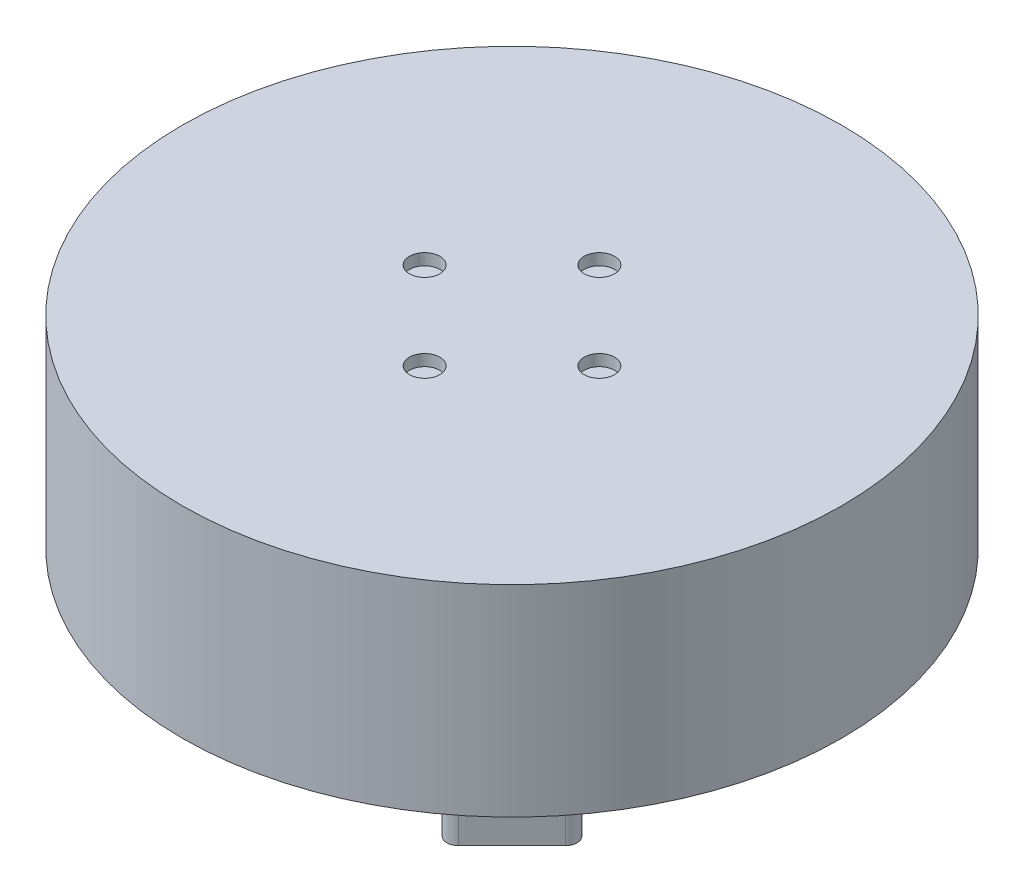
ISO-10303-21;
HEADER;
FILE_DESCRIPTION(('STEP AP214'),'2;1');
FILE_NAME('part.step','',(''),(''),'','','');
FILE_SCHEMA(('AUTOMOTIVE_DESIGN { 1 0 10303 214 1 1 1 1 }'));
ENDSEC;
DATA;
#1=APPLICATION_CONTEXT('core data for automotive mechanical design processes');
#2=APPLICATION_PROTOCOL_DEFINITION('international standard','automotive_design',2000,#1);
#3=PRODUCT_CONTEXT('',#1,'mechanical');
#4=PRODUCT('Part','Part','',(#3));
#5=PRODUCT_RELATED_PRODUCT_CATEGORY('part','',(#4));
#6=PRODUCT_DEFINITION_FORMATION('','',#4);
#7=PRODUCT_DEFINITION_CONTEXT('part definition',#1,'design');
#8=PRODUCT_DEFINITION('design','',#6,#7);
#9=PRODUCT_DEFINITION_SHAPE('','',#8);
#10=(LENGTH_UNIT() NAMED_UNIT(*) SI_UNIT(.MILLI.,.METRE.));
#11=(NAMED_UNIT(*) PLANE_ANGLE_UNIT() SI_UNIT($,.RADIAN.));
#12=(NAMED_UNIT(*) SI_UNIT($,.STERADIAN.) SOLID_ANGLE_UNIT());
#13=UNCERTAINTY_MEASURE_WITH_UNIT(LENGTH_MEASURE(1.E-05),#10,'distance_accuracy_value','');
#14=(GEOMETRIC_REPRESENTATION_CONTEXT(3) GLOBAL_UNCERTAINTY_ASSIGNED_CONTEXT((#13)) GLOBAL_UNIT_ASSIGNED_CONTEXT((#10,
#11,#12)) REPRESENTATION_CONTEXT('',''));
#15=CARTESIAN_POINT('',(0.,0.,0.));
#16=DIRECTION('',(0.,0.,1.));
#17=DIRECTION('',(1.,0.,0.));
#18=AXIS2_PLACEMENT_3D('',#15,#16,#17);
#19=CARTESIAN_POINT('',(0.,0.,0.));
#20=DIRECTION('',(0.,1.,0.));
#21=DIRECTION('',(0.,0.,1.));
#22=AXIS2_PLACEMENT_3D('',#19,#20,#21);
#23=PLANE('',#22);
#24=CARTESIAN_POINT('',(0.,0.,0.));
#25=DIRECTION('',(0.,1.,0.));
#26=DIRECTION('',(0.,0.,1.));
#27=AXIS2_PLACEMENT_3D('',#24,#25,#26);
#28=CIRCLE('',#27,43.4);
#29=CARTESIAN_POINT('',(0.,0.,43.4));
#30=VERTEX_POINT('',#29);
#31=EDGE_CURVE('E43',#30,#30,#28,.T.);
#32=ORIENTED_EDGE('',*,*,#31,.F.);
#33=EDGE_LOOP('',(#32));
#34=FACE_BOUND('',#33,.T.);
#35=CARTESIAN_POINT('',(-16.,0.,0.));
#36=DIRECTION('',(0.,-1.,0.));
#37=DIRECTION('',(0.,0.,-1.));
#38=AXIS2_PLACEMENT_3D('',#35,#36,#37);
#39=CIRCLE('',#38,2.);
#40=CARTESIAN_POINT('',(-16.,0.,-2.));
#41=VERTEX_POINT('',#40);
#42=EDGE_CURVE('E101',#41,#41,#39,.T.);
#43=ORIENTED_EDGE('',*,*,#42,.F.);
#44=EDGE_LOOP('',(#43));
#45=FACE_BOUND('',#44,.T.);
#46=CARTESIAN_POINT('',(0.,0.,-16.));
#47=DIRECTION('',(0.,-1.,0.));
#48=DIRECTION('',(0.,0.,-1.));
#49=AXIS2_PLACEMENT_3D('',#46,#47,#48);
#50=CIRCLE('',#49,2.);
#51=CARTESIAN_POINT('',(0.,0.,-18.));
#52=VERTEX_POINT('',#51);
#53=EDGE_CURVE('E125',#52,#52,#50,.T.);
#54=ORIENTED_EDGE('',*,*,#53,.F.);
#55=EDGE_LOOP('',(#54));
#56=FACE_BOUND('',#55,.T.);
#57=CARTESIAN_POINT('',(16.,0.,0.));
#58=DIRECTION('',(0.,-1.,0.));
#59=DIRECTION('',(0.,0.,-1.));
#60=AXIS2_PLACEMENT_3D('',#57,#58,#59);
#61=CIRCLE('',#60,2.);
#62=CARTESIAN_POINT('',(16.,0.,-2.));
#63=VERTEX_POINT('',#62);
#64=EDGE_CURVE('E116',#63,#63,#61,.T.);
#65=ORIENTED_EDGE('',*,*,#64,.F.);
#66=EDGE_LOOP('',(#65));
#67=FACE_BOUND('',#66,.T.);
#68=CARTESIAN_POINT('',(0.,0.,16.));
#69=DIRECTION('',(0.,-1.,0.));
#70=DIRECTION('',(0.,0.,-1.));
#71=AXIS2_PLACEMENT_3D('',#68,#69,#70);
#72=CIRCLE('',#71,2.);
#73=CARTESIAN_POINT('',(0.,0.,14.));
#74=VERTEX_POINT('',#73);
#75=EDGE_CURVE('E111',#74,#74,#72,.T.);
#76=ORIENTED_EDGE('',*,*,#75,.F.);
#77=EDGE_LOOP('',(#76));
#78=FACE_BOUND('',#77,.T.);
#79=CARTESIAN_POINT('',(23.3345237791561,0.,30.4055915910215));
#80=DIRECTION('',(0.,-1.,0.));
#81=DIRECTION('',(0.,0.,-1.));
#82=AXIS2_PLACEMENT_3D('',#79,#80,#81);
#83=CIRCLE('',#82,1.50000000000001);
#84=CARTESIAN_POINT('',(24.3951839509359,0.,31.4662517628014));
#85=VERTEX_POINT('',#84);
#86=CARTESIAN_POINT('',(22.2738636073762,0.,29.3449314192417));
#87=VERTEX_POINT('',#86);
#88=EDGE_CURVE('E98',#85,#87,#83,.T.);
#89=ORIENTED_EDGE('',*,*,#88,.F.);
#90=DIRECTION('',(-0.707106781186547,0.,0.707106781186548));
#91=VECTOR('',#90,1.);
#92=CARTESIAN_POINT('',(24.3951839509359,0.,31.4662517628014));
#93=LINE('',#92,#91);
#94=CARTESIAN_POINT('',(31.4662517628014,0.,24.3951839509359));
#95=VERTEX_POINT('',#94);
#96=EDGE_CURVE('E99',#95,#85,#93,.T.);
#97=ORIENTED_EDGE('',*,*,#96,.F.);
#98=CARTESIAN_POINT('',(30.4055915910215,0.,23.3345237791561));
#99=DIRECTION('',(0.,-1.,0.));
#100=DIRECTION('',(0.,0.,-1.));
#101=AXIS2_PLACEMENT_3D('',#98,#99,#100);
#102=CIRCLE('',#101,1.5);
#103=CARTESIAN_POINT('',(29.3449314192417,0.,22.2738636073763));
#104=VERTEX_POINT('',#103);
#105=EDGE_CURVE('E56',#104,#95,#102,.T.);
#106=ORIENTED_EDGE('',*,*,#105,.F.);
#107=DIRECTION('',(0.707106781186548,0.,-0.707106781186547));
#108=VECTOR('',#107,1.);
#109=CARTESIAN_POINT('',(22.2738636073762,0.,29.3449314192417));
#110=LINE('',#109,#108);
#111=EDGE_CURVE('E53',#87,#104,#110,.T.);
#112=ORIENTED_EDGE('',*,*,#111,.F.);
#113=EDGE_LOOP('',(#89,#97,#106,#112));
#114=FACE_BOUND('',#113,.T.);
#115=ADVANCED_FACE('F39',(#34,#45,#56,#67,#78,#114),#23,.F.);
#116=CARTESIAN_POINT('',(0.,26.5,0.));
#117=DIRECTION('',(0.,-1.,0.));
#118=DIRECTION('',(0.,0.,-1.));
#119=AXIS2_PLACEMENT_3D('',#116,#117,#118);
#120=CYLINDRICAL_SURFACE('',#119,43.4);
#121=CARTESIAN_POINT('',(0.,26.5,0.));
#122=DIRECTION('',(0.,1.,0.));
#123=DIRECTION('',(0.,0.,1.));
#124=AXIS2_PLACEMENT_3D('',#121,#122,#123);
#125=CIRCLE('',#124,43.4);
#126=CARTESIAN_POINT('',(0.,26.5,43.4));
#127=VERTEX_POINT('',#126);
#128=EDGE_CURVE('E11',#127,#127,#125,.T.);
#129=ORIENTED_EDGE('',*,*,#128,.F.);
#130=EDGE_LOOP('',(#129));
#131=FACE_BOUND('',#130,.T.);
#132=ORIENTED_EDGE('',*,*,#31,.T.);
#133=EDGE_LOOP('',(#132));
#134=FACE_BOUND('',#133,.T.);
#135=ADVANCED_FACE('F41',(#131,#134),#120,.T.);
#136=CARTESIAN_POINT('',(0.,26.5,0.));
#137=DIRECTION('',(0.,1.,0.));
#138=DIRECTION('',(0.,0.,1.));
#139=AXIS2_PLACEMENT_3D('',#136,#137,#138);
#140=PLANE('',#139);
#141=CARTESIAN_POINT('',(0.,26.5,-11.5));
#142=DIRECTION('',(0.,1.,0.));
#143=DIRECTION('',(0.,0.,1.));
#144=AXIS2_PLACEMENT_3D('',#141,#142,#143);
#145=CIRCLE('',#144,2.);
#146=CARTESIAN_POINT('',(0.,26.5,-9.5));
#147=VERTEX_POINT('',#146);
#148=EDGE_CURVE('E171',#147,#147,#145,.T.);
#149=ORIENTED_EDGE('',*,*,#148,.F.);
#150=EDGE_LOOP('',(#149));
#151=FACE_BOUND('',#150,.T.);
#152=CARTESIAN_POINT('',(11.5,26.5,0.));
#153=DIRECTION('',(0.,1.,0.));
#154=DIRECTION('',(0.,0.,1.));
#155=AXIS2_PLACEMENT_3D('',#152,#153,#154);
#156=CIRCLE('',#155,2.);
#157=CARTESIAN_POINT('',(11.5,26.5,2.));
#158=VERTEX_POINT('',#157);
#159=EDGE_CURVE('E172',#158,#158,#156,.T.);
#160=ORIENTED_EDGE('',*,*,#159,.F.);
#161=EDGE_LOOP('',(#160));
#162=FACE_BOUND('',#161,.T.);
#163=CARTESIAN_POINT('',(0.,26.5,11.5));
#164=DIRECTION('',(0.,1.,0.));
#165=DIRECTION('',(0.,0.,1.));
#166=AXIS2_PLACEMENT_3D('',#163,#164,#165);
#167=CIRCLE('',#166,2.);
#168=CARTESIAN_POINT('',(0.,26.5,13.5));
#169=VERTEX_POINT('',#168);
#170=EDGE_CURVE('E162',#169,#169,#167,.T.);
#171=ORIENTED_EDGE('',*,*,#170,.F.);
#172=EDGE_LOOP('',(#171));
#173=FACE_BOUND('',#172,.T.);
#174=CARTESIAN_POINT('',(-11.5,26.5,0.));
#175=DIRECTION('',(0.,1.,0.));
#176=DIRECTION('',(0.,0.,1.));
#177=AXIS2_PLACEMENT_3D('',#174,#175,#176);
#178=CIRCLE('',#177,2.);
#179=CARTESIAN_POINT('',(-11.5,26.5,2.));
#180=VERTEX_POINT('',#179);
#181=EDGE_CURVE('E159',#180,#180,#178,.T.);
#182=ORIENTED_EDGE('',*,*,#181,.F.);
#183=EDGE_LOOP('',(#182));
#184=FACE_BOUND('',#183,.T.);
#185=ORIENTED_EDGE('',*,*,#128,.T.);
#186=EDGE_LOOP('',(#185));
#187=FACE_BOUND('',#186,.T.);
#188=ADVANCED_FACE('F189',(#151,#162,#173,#184,#187),#140,.T.);
#189=CARTESIAN_POINT('',(-16.,1.5,0.));
#190=DIRECTION('',(0.,-1.,0.));
#191=DIRECTION('',(0.,0.,-1.));
#192=AXIS2_PLACEMENT_3D('',#189,#190,#191);
#193=CYLINDRICAL_SURFACE('',#192,2.);
#194=CARTESIAN_POINT('',(-16.,1.5,0.));
#195=DIRECTION('',(0.,-1.,0.));
#196=DIRECTION('',(0.,0.,-1.));
#197=AXIS2_PLACEMENT_3D('',#194,#195,#196);
#198=CIRCLE('',#197,2.);
#199=CARTESIAN_POINT('',(-16.,1.5,-2.));
#200=VERTEX_POINT('',#199);
#201=EDGE_CURVE('E102',#200,#200,#198,.T.);
#202=ORIENTED_EDGE('',*,*,#201,.F.);
#203=EDGE_LOOP('',(#202));
#204=FACE_BOUND('',#203,.T.);
#205=ORIENTED_EDGE('',*,*,#42,.T.);
#206=EDGE_LOOP('',(#205));
#207=FACE_BOUND('',#206,.T.);
#208=ADVANCED_FACE('F132',(#204,#207),#193,.F.);
#209=CARTESIAN_POINT('',(-16.,1.5,0.));
#210=DIRECTION('',(0.,-1.,0.));
#211=DIRECTION('',(0.,0.,-1.));
#212=AXIS2_PLACEMENT_3D('',#209,#210,#211);
#213=PLANE('',#212);
#214=ORIENTED_EDGE('',*,*,#201,.T.);
#215=EDGE_LOOP('',(#214));
#216=FACE_BOUND('',#215,.T.);
#217=ADVANCED_FACE('F212',(#216),#213,.T.);
#218=CARTESIAN_POINT('',(0.,1.5,-16.));
#219=DIRECTION('',(0.,-1.,0.));
#220=DIRECTION('',(0.,0.,-1.));
#221=AXIS2_PLACEMENT_3D('',#218,#219,#220);
#222=CYLINDRICAL_SURFACE('',#221,2.);
#223=CARTESIAN_POINT('',(0.,1.5,-16.));
#224=DIRECTION('',(0.,-1.,0.));
#225=DIRECTION('',(0.,0.,-1.));
#226=AXIS2_PLACEMENT_3D('',#223,#224,#225);
#227=CIRCLE('',#226,2.);
#228=CARTESIAN_POINT('',(0.,1.5,-18.));
#229=VERTEX_POINT('',#228);
#230=EDGE_CURVE('E124',#229,#229,#227,.T.);
#231=ORIENTED_EDGE('',*,*,#230,.F.);
#232=EDGE_LOOP('',(#231));
#233=FACE_BOUND('',#232,.T.);
#234=ORIENTED_EDGE('',*,*,#53,.T.);
#235=EDGE_LOOP('',(#234));
#236=FACE_BOUND('',#235,.T.);
#237=ADVANCED_FACE('F221',(#233,#236),#222,.F.);
#238=CARTESIAN_POINT('',(0.,1.5,-16.));
#239=DIRECTION('',(0.,-1.,0.));
#240=DIRECTION('',(0.,0.,-1.));
#241=AXIS2_PLACEMENT_3D('',#238,#239,#240);
#242=PLANE('',#241);
#243=ORIENTED_EDGE('',*,*,#230,.T.);
#244=EDGE_LOOP('',(#243));
#245=FACE_BOUND('',#244,.T.);
#246=ADVANCED_FACE('F231',(#245),#242,.T.);
#247=CARTESIAN_POINT('',(16.,1.5,0.));
#248=DIRECTION('',(0.,-1.,0.));
#249=DIRECTION('',(0.,0.,-1.));
#250=AXIS2_PLACEMENT_3D('',#247,#248,#249);
#251=CYLINDRICAL_SURFACE('',#250,2.);
#252=CARTESIAN_POINT('',(16.,1.5,0.));
#253=DIRECTION('',(0.,-1.,0.));
#254=DIRECTION('',(0.,0.,-1.));
#255=AXIS2_PLACEMENT_3D('',#252,#253,#254);
#256=CIRCLE('',#255,2.);
#257=CARTESIAN_POINT('',(16.,1.5,-2.));
#258=VERTEX_POINT('',#257);
#259=EDGE_CURVE('E117',#258,#258,#256,.T.);
#260=ORIENTED_EDGE('',*,*,#259,.F.);
#261=EDGE_LOOP('',(#260));
#262=FACE_BOUND('',#261,.T.);
#263=ORIENTED_EDGE('',*,*,#64,.T.);
#264=EDGE_LOOP('',(#263));
#265=FACE_BOUND('',#264,.T.);
#266=ADVANCED_FACE('F245',(#262,#265),#251,.F.);
#267=CARTESIAN_POINT('',(16.,1.5,0.));
#268=DIRECTION('',(0.,-1.,0.));
#269=DIRECTION('',(0.,0.,-1.));
#270=AXIS2_PLACEMENT_3D('',#267,#268,#269);
#271=PLANE('',#270);
#272=ORIENTED_EDGE('',*,*,#259,.T.);
#273=EDGE_LOOP('',(#272));
#274=FACE_BOUND('',#273,.T.);
#275=ADVANCED_FACE('F252',(#274),#271,.T.);
#276=CARTESIAN_POINT('',(0.,1.5,16.));
#277=DIRECTION('',(0.,-1.,0.));
#278=DIRECTION('',(0.,0.,-1.));
#279=AXIS2_PLACEMENT_3D('',#276,#277,#278);
#280=CYLINDRICAL_SURFACE('',#279,2.);
#281=CARTESIAN_POINT('',(0.,1.5,16.));
#282=DIRECTION('',(0.,-1.,0.));
#283=DIRECTION('',(0.,0.,-1.));
#284=AXIS2_PLACEMENT_3D('',#281,#282,#283);
#285=CIRCLE('',#284,2.);
#286=CARTESIAN_POINT('',(0.,1.5,14.));
#287=VERTEX_POINT('',#286);
#288=EDGE_CURVE('E109',#287,#287,#285,.T.);
#289=ORIENTED_EDGE('',*,*,#288,.F.);
#290=EDGE_LOOP('',(#289));
#291=FACE_BOUND('',#290,.T.);
#292=ORIENTED_EDGE('',*,*,#75,.T.);
#293=EDGE_LOOP('',(#292));
#294=FACE_BOUND('',#293,.T.);
#295=ADVANCED_FACE('F259',(#291,#294),#280,.F.);
#296=CARTESIAN_POINT('',(0.,1.5,16.));
#297=DIRECTION('',(0.,-1.,0.));
#298=DIRECTION('',(0.,0.,-1.));
#299=AXIS2_PLACEMENT_3D('',#296,#297,#298);
#300=PLANE('',#299);
#301=ORIENTED_EDGE('',*,*,#288,.T.);
#302=EDGE_LOOP('',(#301));
#303=FACE_BOUND('',#302,.T.);
#304=ADVANCED_FACE('F267',(#303),#300,.T.);
#305=CARTESIAN_POINT('',(23.3345237791561,-6.,30.4055915910215));
#306=DIRECTION('',(0.,1.,0.));
#307=DIRECTION('',(0.,0.,1.));
#308=AXIS2_PLACEMENT_3D('',#305,#306,#307);
#309=CYLINDRICAL_SURFACE('',#308,1.50000000000001);
#310=ORIENTED_EDGE('',*,*,#88,.T.);
#311=DIRECTION('',(0.,1.,0.));
#312=VECTOR('',#311,1.);
#313=CARTESIAN_POINT('',(22.2738636073762,-6.,29.3449314192417));
#314=LINE('',#313,#312);
#315=CARTESIAN_POINT('',(22.2738636073762,-6.,29.3449314192417));
#316=VERTEX_POINT('',#315);
#317=EDGE_CURVE('E82',#316,#87,#314,.T.);
#318=ORIENTED_EDGE('',*,*,#317,.F.);
#319=CARTESIAN_POINT('',(23.3345237791561,-6.,30.4055915910215));
#320=DIRECTION('',(0.,-1.,0.));
#321=DIRECTION('',(0.,0.,-1.));
#322=AXIS2_PLACEMENT_3D('',#319,#320,#321);
#323=CIRCLE('',#322,1.50000000000001);
#324=CARTESIAN_POINT('',(24.3951839509359,-6.,31.4662517628014));
#325=VERTEX_POINT('',#324);
#326=EDGE_CURVE('E90',#325,#316,#323,.T.);
#327=ORIENTED_EDGE('',*,*,#326,.F.);
#328=DIRECTION('',(0.,1.,0.));
#329=VECTOR('',#328,1.);
#330=CARTESIAN_POINT('',(24.3951839509359,-6.,31.4662517628014));
#331=LINE('',#330,#329);
#332=EDGE_CURVE('E149',#325,#85,#331,.T.);
#333=ORIENTED_EDGE('',*,*,#332,.T.);
#334=EDGE_LOOP('',(#310,#318,#327,#333));
#335=FACE_BOUND('',#334,.T.);
#336=ADVANCED_FACE('F96',(#335),#309,.T.);
#337=CARTESIAN_POINT('',(22.2738636073762,-6.,29.3449314192417));
#338=DIRECTION('',(0.707106781186547,0.,0.707106781186548));
#339=DIRECTION('',(0.707106781186548,0.,-0.707106781186547));
#340=AXIS2_PLACEMENT_3D('',#337,#338,#339);
#341=PLANE('',#340);
#342=ORIENTED_EDGE('',*,*,#111,.T.);
#343=DIRECTION('',(0.,1.,0.));
#344=VECTOR('',#343,1.);
#345=CARTESIAN_POINT('',(29.3449314192417,-6.,22.2738636073763));
#346=LINE('',#345,#344);
#347=CARTESIAN_POINT('',(29.3449314192417,-6.,22.2738636073763));
#348=VERTEX_POINT('',#347);
#349=EDGE_CURVE('E84',#348,#104,#346,.T.);
#350=ORIENTED_EDGE('',*,*,#349,.F.);
#351=DIRECTION('',(0.707106781186548,0.,-0.707106781186547));
#352=VECTOR('',#351,1.);
#353=CARTESIAN_POINT('',(22.2738636073762,-6.,29.3449314192417));
#354=LINE('',#353,#352);
#355=EDGE_CURVE('E80',#316,#348,#354,.T.);
#356=ORIENTED_EDGE('',*,*,#355,.F.);
#357=ORIENTED_EDGE('',*,*,#317,.T.);
#358=EDGE_LOOP('',(#342,#350,#356,#357));
#359=FACE_BOUND('',#358,.T.);
#360=ADVANCED_FACE('F76',(#359),#341,.F.);
#361=CARTESIAN_POINT('',(30.4055915910215,-6.,23.3345237791561));
#362=DIRECTION('',(0.,1.,0.));
#363=DIRECTION('',(0.,0.,1.));
#364=AXIS2_PLACEMENT_3D('',#361,#362,#363);
#365=CYLINDRICAL_SURFACE('',#364,1.5);
#366=ORIENTED_EDGE('',*,*,#105,.T.);
#367=DIRECTION('',(0.,1.,0.));
#368=VECTOR('',#367,1.);
#369=CARTESIAN_POINT('',(31.4662517628014,-6.,24.3951839509359));
#370=LINE('',#369,#368);
#371=CARTESIAN_POINT('',(31.4662517628014,-6.,24.3951839509359));
#372=VERTEX_POINT('',#371);
#373=EDGE_CURVE('E108',#372,#95,#370,.T.);
#374=ORIENTED_EDGE('',*,*,#373,.F.);
#375=CARTESIAN_POINT('',(30.4055915910215,-6.,23.3345237791561));
#376=DIRECTION('',(0.,-1.,0.));
#377=DIRECTION('',(0.,0.,-1.));
#378=AXIS2_PLACEMENT_3D('',#375,#376,#377);
#379=CIRCLE('',#378,1.5);
#380=EDGE_CURVE('E86',#348,#372,#379,.T.);
#381=ORIENTED_EDGE('',*,*,#380,.F.);
#382=ORIENTED_EDGE('',*,*,#349,.T.);
#383=EDGE_LOOP('',(#366,#374,#381,#382));
#384=FACE_BOUND('',#383,.T.);
#385=ADVANCED_FACE('F299',(#384),#365,.T.);
#386=CARTESIAN_POINT('',(24.3951839509359,-6.,31.4662517628014));
#387=DIRECTION('',(-0.707106781186548,0.,-0.707106781186547));
#388=DIRECTION('',(-0.707106781186547,0.,0.707106781186548));
#389=AXIS2_PLACEMENT_3D('',#386,#387,#388);
#390=PLANE('',#389);
#391=ORIENTED_EDGE('',*,*,#96,.T.);
#392=ORIENTED_EDGE('',*,*,#332,.F.);
#393=DIRECTION('',(-0.707106781186547,0.,0.707106781186548));
#394=VECTOR('',#393,1.);
#395=CARTESIAN_POINT('',(24.3951839509359,-6.,31.4662517628014));
#396=LINE('',#395,#394);
#397=EDGE_CURVE('E92',#372,#325,#396,.T.);
#398=ORIENTED_EDGE('',*,*,#397,.F.);
#399=ORIENTED_EDGE('',*,*,#373,.T.);
#400=EDGE_LOOP('',(#391,#392,#398,#399));
#401=FACE_BOUND('',#400,.T.);
#402=ADVANCED_FACE('F147',(#401),#390,.F.);
#403=CARTESIAN_POINT('',(23.3345237791561,-6.,30.4055915910215));
#404=DIRECTION('',(0.,-1.,0.));
#405=DIRECTION('',(0.,0.,-1.));
#406=AXIS2_PLACEMENT_3D('',#403,#404,#405);
#407=PLANE('',#406);
#408=ORIENTED_EDGE('',*,*,#326,.T.);
#409=ORIENTED_EDGE('',*,*,#355,.T.);
#410=ORIENTED_EDGE('',*,*,#380,.T.);
#411=ORIENTED_EDGE('',*,*,#397,.T.);
#412=EDGE_LOOP('',(#408,#409,#410,#411));
#413=FACE_BOUND('',#412,.T.);
#414=ADVANCED_FACE('F91',(#413),#407,.T.);
#415=CARTESIAN_POINT('',(-11.5,25.,0.));
#416=DIRECTION('',(0.,1.,0.));
#417=DIRECTION('',(0.,0.,1.));
#418=AXIS2_PLACEMENT_3D('',#415,#416,#417);
#419=CYLINDRICAL_SURFACE('',#418,2.);
#420=CARTESIAN_POINT('',(-11.5,25.,0.));
#421=DIRECTION('',(0.,1.,0.));
#422=DIRECTION('',(0.,0.,1.));
#423=AXIS2_PLACEMENT_3D('',#420,#421,#422);
#424=CIRCLE('',#423,2.);
#425=CARTESIAN_POINT('',(-11.5,25.,2.));
#426=VERTEX_POINT('',#425);
#427=EDGE_CURVE('E157',#426,#426,#424,.T.);
#428=ORIENTED_EDGE('',*,*,#427,.F.);
#429=EDGE_LOOP('',(#428));
#430=FACE_BOUND('',#429,.T.);
#431=ORIENTED_EDGE('',*,*,#181,.T.);
#432=EDGE_LOOP('',(#431));
#433=FACE_BOUND('',#432,.T.);
#434=ADVANCED_FACE('F318',(#430,#433),#419,.F.);
#435=CARTESIAN_POINT('',(-11.5,25.,0.));
#436=DIRECTION('',(0.,1.,0.));
#437=DIRECTION('',(0.,0.,1.));
#438=AXIS2_PLACEMENT_3D('',#435,#436,#437);
#439=PLANE('',#438);
#440=ORIENTED_EDGE('',*,*,#427,.T.);
#441=EDGE_LOOP('',(#440));
#442=FACE_BOUND('',#441,.T.);
#443=ADVANCED_FACE('F332',(#442),#439,.T.);
#444=CARTESIAN_POINT('',(0.,25.,11.5));
#445=DIRECTION('',(0.,1.,0.));
#446=DIRECTION('',(0.,0.,1.));
#447=AXIS2_PLACEMENT_3D('',#444,#445,#446);
#448=CYLINDRICAL_SURFACE('',#447,2.);
#449=CARTESIAN_POINT('',(0.,25.,11.5));
#450=DIRECTION('',(0.,1.,0.));
#451=DIRECTION('',(0.,0.,1.));
#452=AXIS2_PLACEMENT_3D('',#449,#450,#451);
#453=CIRCLE('',#452,2.);
#454=CARTESIAN_POINT('',(0.,25.,13.5));
#455=VERTEX_POINT('',#454);
#456=EDGE_CURVE('E161',#455,#455,#453,.T.);
#457=ORIENTED_EDGE('',*,*,#456,.F.);
#458=EDGE_LOOP('',(#457));
#459=FACE_BOUND('',#458,.T.);
#460=ORIENTED_EDGE('',*,*,#170,.T.);
#461=EDGE_LOOP('',(#460));
#462=FACE_BOUND('',#461,.T.);
#463=ADVANCED_FACE('F341',(#459,#462),#448,.F.);
#464=CARTESIAN_POINT('',(0.,25.,11.5));
#465=DIRECTION('',(0.,1.,0.));
#466=DIRECTION('',(0.,0.,1.));
#467=AXIS2_PLACEMENT_3D('',#464,#465,#466);
#468=PLANE('',#467);
#469=ORIENTED_EDGE('',*,*,#456,.T.);
#470=EDGE_LOOP('',(#469));
#471=FACE_BOUND('',#470,.T.);
#472=ADVANCED_FACE('F349',(#471),#468,.T.);
#473=CARTESIAN_POINT('',(11.5,25.,0.));
#474=DIRECTION('',(0.,1.,0.));
#475=DIRECTION('',(0.,0.,1.));
#476=AXIS2_PLACEMENT_3D('',#473,#474,#475);
#477=CYLINDRICAL_SURFACE('',#476,2.);
#478=CARTESIAN_POINT('',(11.5,25.,0.));
#479=DIRECTION('',(0.,1.,0.));
#480=DIRECTION('',(0.,0.,1.));
#481=AXIS2_PLACEMENT_3D('',#478,#479,#480);
#482=CIRCLE('',#481,2.);
#483=CARTESIAN_POINT('',(11.5,25.,2.));
#484=VERTEX_POINT('',#483);
#485=EDGE_CURVE('E167',#484,#484,#482,.T.);
#486=ORIENTED_EDGE('',*,*,#485,.F.);
#487=EDGE_LOOP('',(#486));
#488=FACE_BOUND('',#487,.T.);
#489=ORIENTED_EDGE('',*,*,#159,.T.);
#490=EDGE_LOOP('',(#489));
#491=FACE_BOUND('',#490,.T.);
#492=ADVANCED_FACE('F356',(#488,#491),#477,.F.);
#493=CARTESIAN_POINT('',(11.5,25.,0.));
#494=DIRECTION('',(0.,1.,0.));
#495=DIRECTION('',(0.,0.,1.));
#496=AXIS2_PLACEMENT_3D('',#493,#494,#495);
#497=PLANE('',#496);
#498=ORIENTED_EDGE('',*,*,#485,.T.);
#499=EDGE_LOOP('',(#498));
#500=FACE_BOUND('',#499,.T.);
#501=ADVANCED_FACE('F184',(#500),#497,.T.);
#502=CARTESIAN_POINT('',(0.,25.,-11.5));
#503=DIRECTION('',(0.,1.,0.));
#504=DIRECTION('',(0.,0.,1.));
#505=AXIS2_PLACEMENT_3D('',#502,#503,#504);
#506=CYLINDRICAL_SURFACE('',#505,2.);
#507=CARTESIAN_POINT('',(0.,25.,-11.5));
#508=DIRECTION('',(0.,1.,0.));
#509=DIRECTION('',(0.,0.,1.));
#510=AXIS2_PLACEMENT_3D('',#507,#508,#509);
#511=CIRCLE('',#510,2.);
#512=CARTESIAN_POINT('',(0.,25.,-9.5));
#513=VERTEX_POINT('',#512);
#514=EDGE_CURVE('E145',#513,#513,#511,.T.);
#515=ORIENTED_EDGE('',*,*,#514,.F.);
#516=EDGE_LOOP('',(#515));
#517=FACE_BOUND('',#516,.T.);
#518=ORIENTED_EDGE('',*,*,#148,.T.);
#519=EDGE_LOOP('',(#518));
#520=FACE_BOUND('',#519,.T.);
#521=ADVANCED_FACE('F182',(#517,#520),#506,.F.);
#522=CARTESIAN_POINT('',(0.,25.,-11.5));
#523=DIRECTION('',(0.,1.,0.));
#524=DIRECTION('',(0.,0.,1.));
#525=AXIS2_PLACEMENT_3D('',#522,#523,#524);
#526=PLANE('',#525);
#527=ORIENTED_EDGE('',*,*,#514,.T.);
#528=EDGE_LOOP('',(#527));
#529=FACE_BOUND('',#528,.T.);
#530=ADVANCED_FACE('F178',(#529),#526,.T.);
#531=CLOSED_SHELL('',(#115,#135,#188,#208,#217,#237,#246,#266,#275,#295,#304,#336,#360,#385,
#402,#414,#434,#443,#463,#472,#492,#501,#521,#530));
#532=MANIFOLD_SOLID_BREP('B2',#531);
#533=ADVANCED_BREP_SHAPE_REPRESENTATION('',(#18,#532),#14);
#534=SHAPE_DEFINITION_REPRESENTATION(#9,#533);
ENDSEC;
END-ISO-10303-21;
